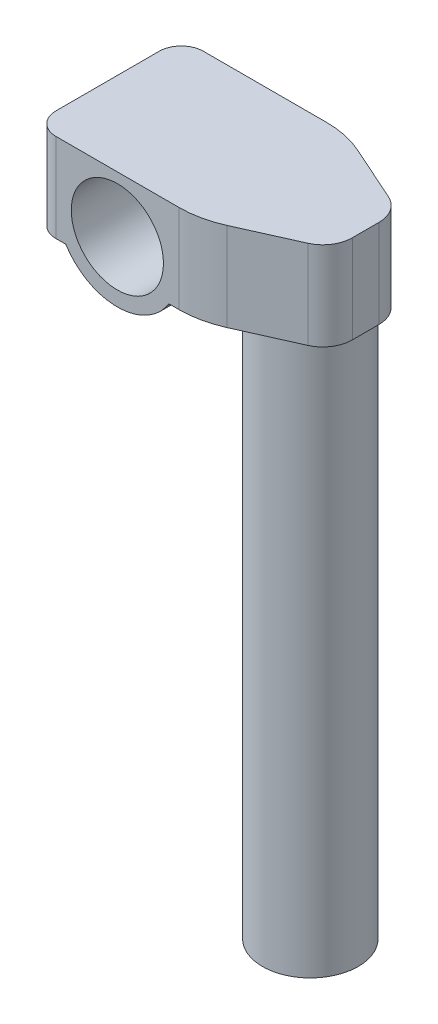
ISO-10303-21;
HEADER;
FILE_DESCRIPTION(('STEP AP214'),'2;1');
FILE_NAME('part.step','',(''),(''),'','','');
FILE_SCHEMA(('AUTOMOTIVE_DESIGN { 1 0 10303 214 1 1 1 1 }'));
ENDSEC;
DATA;
#1=APPLICATION_CONTEXT('core data for automotive mechanical design processes');
#2=APPLICATION_PROTOCOL_DEFINITION('international standard','automotive_design',2000,#1);
#3=PRODUCT_CONTEXT('',#1,'mechanical');
#4=PRODUCT('Part','Part','',(#3));
#5=PRODUCT_RELATED_PRODUCT_CATEGORY('part','',(#4));
#6=PRODUCT_DEFINITION_FORMATION('','',#4);
#7=PRODUCT_DEFINITION_CONTEXT('part definition',#1,'design');
#8=PRODUCT_DEFINITION('design','',#6,#7);
#9=PRODUCT_DEFINITION_SHAPE('','',#8);
#10=(LENGTH_UNIT() NAMED_UNIT(*) SI_UNIT(.MILLI.,.METRE.));
#11=(NAMED_UNIT(*) PLANE_ANGLE_UNIT() SI_UNIT($,.RADIAN.));
#12=(NAMED_UNIT(*) SI_UNIT($,.STERADIAN.) SOLID_ANGLE_UNIT());
#13=UNCERTAINTY_MEASURE_WITH_UNIT(LENGTH_MEASURE(1.E-05),#10,'distance_accuracy_value','');
#14=(GEOMETRIC_REPRESENTATION_CONTEXT(3) GLOBAL_UNCERTAINTY_ASSIGNED_CONTEXT((#13)) GLOBAL_UNIT_ASSIGNED_CONTEXT((#10,
#11,#12)) REPRESENTATION_CONTEXT('',''));
#15=CARTESIAN_POINT('',(0.,0.,0.));
#16=DIRECTION('',(0.,0.,1.));
#17=DIRECTION('',(1.,0.,0.));
#18=AXIS2_PLACEMENT_3D('',#15,#16,#17);
#19=CARTESIAN_POINT('',(-29.,10.,14.));
#20=DIRECTION('',(0.,-1.,0.));
#21=DIRECTION('',(0.,0.,-1.));
#22=AXIS2_PLACEMENT_3D('',#19,#20,#21);
#23=CYLINDRICAL_SURFACE('',#22,6.);
#24=CARTESIAN_POINT('',(-29.,6.,14.));
#25=DIRECTION('',(0.,-1.,0.));
#26=DIRECTION('',(0.,0.,-1.));
#27=AXIS2_PLACEMENT_3D('',#24,#25,#26);
#28=CIRCLE('',#27,6.);
#29=CARTESIAN_POINT('',(-29.,6.,20.));
#30=VERTEX_POINT('',#29);
#31=CARTESIAN_POINT('',(-35.,6.,14.));
#32=VERTEX_POINT('',#31);
#33=EDGE_CURVE('E269',#30,#32,#28,.T.);
#34=ORIENTED_EDGE('',*,*,#33,.F.);
#35=DIRECTION('',(0.,-1.,0.));
#36=VECTOR('',#35,1.);
#37=CARTESIAN_POINT('',(-29.,10.,20.));
#38=LINE('',#37,#36);
#39=CARTESIAN_POINT('',(-29.,30.,20.));
#40=VERTEX_POINT('',#39);
#41=EDGE_CURVE('E12',#40,#30,#38,.T.);
#42=ORIENTED_EDGE('',*,*,#41,.F.);
#43=CARTESIAN_POINT('',(-29.,30.,14.));
#44=DIRECTION('',(0.,1.,0.));
#45=DIRECTION('',(0.,0.,1.));
#46=AXIS2_PLACEMENT_3D('',#43,#44,#45);
#47=CIRCLE('',#46,6.);
#48=CARTESIAN_POINT('',(-35.,30.,14.));
#49=VERTEX_POINT('',#48);
#50=EDGE_CURVE('E165',#49,#40,#47,.T.);
#51=ORIENTED_EDGE('',*,*,#50,.F.);
#52=DIRECTION('',(0.,-1.,0.));
#53=VECTOR('',#52,1.);
#54=CARTESIAN_POINT('',(-35.,10.,14.));
#55=LINE('',#54,#53);
#56=EDGE_CURVE('E67',#49,#32,#55,.T.);
#57=ORIENTED_EDGE('',*,*,#56,.T.);
#58=EDGE_LOOP('',(#34,#42,#51,#57));
#59=FACE_BOUND('',#58,.T.);
#60=ADVANCED_FACE('F52',(#59),#23,.T.);
#61=CARTESIAN_POINT('',(-29.,10.,20.));
#62=DIRECTION('',(0.,0.,-1.));
#63=DIRECTION('',(-1.,0.,0.));
#64=AXIS2_PLACEMENT_3D('',#61,#62,#63);
#65=PLANE('',#64);
#66=CARTESIAN_POINT('',(-12.3376689201528,14.75,20.));
#67=DIRECTION('',(0.,0.,-1.));
#68=DIRECTION('',(1.,0.,0.));
#69=AXIS2_PLACEMENT_3D('',#66,#67,#68);
#70=CIRCLE('',#69,12.5);
#71=CARTESIAN_POINT('',(0.162331079847184,14.75,20.));
#72=VERTEX_POINT('',#71);
#73=EDGE_CURVE('E227',#72,#72,#70,.T.);
#74=ORIENTED_EDGE('',*,*,#73,.T.);
#75=EDGE_LOOP('',(#74));
#76=FACE_BOUND('',#75,.T.);
#77=DIRECTION('',(1.,0.,0.));
#78=VECTOR('',#77,1.);
#79=CARTESIAN_POINT('',(35.,6.,20.));
#80=LINE('',#79,#78);
#81=CARTESIAN_POINT('',(1.65116591338497,6.,20.));
#82=VERTEX_POINT('',#81);
#83=CARTESIAN_POINT('',(4.44212866064467,6.,20.));
#84=VERTEX_POINT('',#83);
#85=EDGE_CURVE('E246',#82,#84,#80,.T.);
#86=ORIENTED_EDGE('',*,*,#85,.T.);
#87=DIRECTION('',(0.,-1.,0.));
#88=VECTOR('',#87,1.);
#89=CARTESIAN_POINT('',(4.44212866064458,10.,20.));
#90=LINE('',#89,#88);
#91=CARTESIAN_POINT('',(4.44212866064458,30.,20.));
#92=VERTEX_POINT('',#91);
#93=EDGE_CURVE('E60',#92,#84,#90,.T.);
#94=ORIENTED_EDGE('',*,*,#93,.F.);
#95=DIRECTION('',(1.,0.,0.));
#96=VECTOR('',#95,1.);
#97=CARTESIAN_POINT('',(-29.,30.,20.));
#98=LINE('',#97,#96);
#99=EDGE_CURVE('E211',#40,#92,#98,.T.);
#100=ORIENTED_EDGE('',*,*,#99,.F.);
#101=ORIENTED_EDGE('',*,*,#41,.T.);
#102=DIRECTION('',(1.,0.,0.));
#103=VECTOR('',#102,1.);
#104=CARTESIAN_POINT('',(-35.,6.,20.));
#105=LINE('',#104,#103);
#106=CARTESIAN_POINT('',(-26.3265037536906,6.,20.));
#107=VERTEX_POINT('',#106);
#108=EDGE_CURVE('E219',#30,#107,#105,.T.);
#109=ORIENTED_EDGE('',*,*,#108,.T.);
#110=CARTESIAN_POINT('',(-12.3376689201528,14.75,20.));
#111=DIRECTION('',(0.,0.,1.));
#112=DIRECTION('',(1.,0.,0.));
#113=AXIS2_PLACEMENT_3D('',#110,#111,#112);
#114=CIRCLE('',#113,16.5);
#115=EDGE_CURVE('E242',#107,#82,#114,.T.);
#116=ORIENTED_EDGE('',*,*,#115,.T.);
#117=EDGE_LOOP('',(#86,#94,#100,#101,#109,#116));
#118=FACE_BOUND('',#117,.T.);
#119=ADVANCED_FACE('F327',(#76,#118),#65,.F.);
#120=CARTESIAN_POINT('',(4.44212866064467,10.,-5.99999999999999));
#121=DIRECTION('',(0.,-1.,0.));
#122=DIRECTION('',(0.,0.,-1.));
#123=AXIS2_PLACEMENT_3D('',#120,#121,#122);
#124=CYLINDRICAL_SURFACE('',#123,26.);
#125=CARTESIAN_POINT('',(4.44212866064467,6.,-5.99999999999999));
#126=DIRECTION('',(0.,-1.,0.));
#127=DIRECTION('',(0.,0.,-1.));
#128=AXIS2_PLACEMENT_3D('',#125,#126,#127);
#129=CIRCLE('',#128,26.);
#130=CARTESIAN_POINT('',(15.0721315666849,6.,17.7276850581252));
#131=VERTEX_POINT('',#130);
#132=EDGE_CURVE('E162',#131,#84,#129,.T.);
#133=ORIENTED_EDGE('',*,*,#132,.F.);
#134=DIRECTION('',(0.,-1.,0.));
#135=VECTOR('',#134,1.);
#136=CARTESIAN_POINT('',(15.0721315666849,10.,17.7276850581252));
#137=LINE('',#136,#135);
#138=CARTESIAN_POINT('',(15.0721315666849,30.,17.7276850581252));
#139=VERTEX_POINT('',#138);
#140=EDGE_CURVE('E75',#139,#131,#137,.T.);
#141=ORIENTED_EDGE('',*,*,#140,.F.);
#142=CARTESIAN_POINT('',(4.44212866064467,30.,-5.99999999999999));
#143=DIRECTION('',(0.,1.,0.));
#144=DIRECTION('',(0.,0.,1.));
#145=AXIS2_PLACEMENT_3D('',#142,#143,#144);
#146=CIRCLE('',#145,26.);
#147=EDGE_CURVE('E207',#92,#139,#146,.T.);
#148=ORIENTED_EDGE('',*,*,#147,.F.);
#149=ORIENTED_EDGE('',*,*,#93,.T.);
#150=EDGE_LOOP('',(#133,#141,#148,#149));
#151=FACE_BOUND('',#150,.T.);
#152=ADVANCED_FACE('F322',(#151),#124,.T.);
#153=CARTESIAN_POINT('',(15.0721315666849,10.,17.7276850581252));
#154=DIRECTION('',(-0.408846265616927,0.,-0.912603271466355));
#155=DIRECTION('',(-0.912603271466355,0.,0.408846265616927));
#156=AXIS2_PLACEMENT_3D('',#153,#154,#155);
#157=PLANE('',#156);
#158=DIRECTION('',(-0.912603271466355,0.,0.408846265616927));
#159=VECTOR('',#158,1.);
#160=CARTESIAN_POINT('',(15.0721315666849,6.,17.7276850581252));
#161=LINE('',#160,#159);
#162=CARTESIAN_POINT('',(30.2707701249354,6.,10.9186949840289));
#163=VERTEX_POINT('',#162);
#164=EDGE_CURVE('E288',#163,#131,#161,.T.);
#165=ORIENTED_EDGE('',*,*,#164,.F.);
#166=DIRECTION('',(0.,-1.,0.));
#167=VECTOR('',#166,1.);
#168=CARTESIAN_POINT('',(30.2707701249354,10.,10.9186949840289));
#169=LINE('',#168,#167);
#170=CARTESIAN_POINT('',(30.2707701249354,30.,10.9186949840289));
#171=VERTEX_POINT('',#170);
#172=EDGE_CURVE('E314',#171,#163,#169,.T.);
#173=ORIENTED_EDGE('',*,*,#172,.F.);
#174=DIRECTION('',(0.912603271466355,0.,-0.408846265616927));
#175=VECTOR('',#174,1.);
#176=CARTESIAN_POINT('',(15.0721315666849,30.,17.7276850581252));
#177=LINE('',#176,#175);
#178=EDGE_CURVE('E203',#139,#171,#177,.T.);
#179=ORIENTED_EDGE('',*,*,#178,.F.);
#180=ORIENTED_EDGE('',*,*,#140,.T.);
#181=EDGE_LOOP('',(#165,#173,#179,#180));
#182=FACE_BOUND('',#181,.T.);
#183=ADVANCED_FACE('F357',(#182),#157,.F.);
#184=CARTESIAN_POINT('',(27.,10.,3.6178688122981));
#185=DIRECTION('',(0.,-1.,0.));
#186=DIRECTION('',(0.,0.,-1.));
#187=AXIS2_PLACEMENT_3D('',#184,#185,#186);
#188=CYLINDRICAL_SURFACE('',#187,8.);
#189=CARTESIAN_POINT('',(27.,6.,3.6178688122981));
#190=DIRECTION('',(0.,-1.,0.));
#191=DIRECTION('',(0.,0.,-1.));
#192=AXIS2_PLACEMENT_3D('',#189,#190,#191);
#193=CIRCLE('',#192,8.);
#194=CARTESIAN_POINT('',(35.,6.,3.61786881229805));
#195=VERTEX_POINT('',#194);
#196=EDGE_CURVE('E284',#195,#163,#193,.T.);
#197=ORIENTED_EDGE('',*,*,#196,.F.);
#198=DIRECTION('',(0.,-1.,0.));
#199=VECTOR('',#198,1.);
#200=CARTESIAN_POINT('',(35.,10.,3.61786881229806));
#201=LINE('',#200,#199);
#202=CARTESIAN_POINT('',(35.,30.,3.61786881229806));
#203=VERTEX_POINT('',#202);
#204=EDGE_CURVE('E311',#203,#195,#201,.T.);
#205=ORIENTED_EDGE('',*,*,#204,.F.);
#206=CARTESIAN_POINT('',(27.,30.,3.6178688122981));
#207=DIRECTION('',(0.,1.,0.));
#208=DIRECTION('',(0.,0.,1.));
#209=AXIS2_PLACEMENT_3D('',#206,#207,#208);
#210=CIRCLE('',#209,8.);
#211=EDGE_CURVE('E199',#171,#203,#210,.T.);
#212=ORIENTED_EDGE('',*,*,#211,.F.);
#213=ORIENTED_EDGE('',*,*,#172,.T.);
#214=EDGE_LOOP('',(#197,#205,#212,#213));
#215=FACE_BOUND('',#214,.T.);
#216=ADVANCED_FACE('F355',(#215),#188,.T.);
#217=CARTESIAN_POINT('',(35.,10.,3.61786881229806));
#218=DIRECTION('',(-1.,0.,0.));
#219=DIRECTION('',(0.,0.,1.));
#220=AXIS2_PLACEMENT_3D('',#217,#218,#219);
#221=PLANE('',#220);
#222=DIRECTION('',(0.,0.,1.));
#223=VECTOR('',#222,1.);
#224=CARTESIAN_POINT('',(35.,6.,-20.));
#225=LINE('',#224,#223);
#226=CARTESIAN_POINT('',(35.,6.,-3.6178688122981));
#227=VERTEX_POINT('',#226);
#228=EDGE_CURVE('E253',#227,#195,#225,.T.);
#229=ORIENTED_EDGE('',*,*,#228,.F.);
#230=DIRECTION('',(0.,-1.,0.));
#231=VECTOR('',#230,1.);
#232=CARTESIAN_POINT('',(35.,10.,-3.61786881229806));
#233=LINE('',#232,#231);
#234=CARTESIAN_POINT('',(35.,30.,-3.61786881229806));
#235=VERTEX_POINT('',#234);
#236=EDGE_CURVE('E308',#235,#227,#233,.T.);
#237=ORIENTED_EDGE('',*,*,#236,.F.);
#238=DIRECTION('',(0.,0.,-1.));
#239=VECTOR('',#238,1.);
#240=CARTESIAN_POINT('',(35.,30.,3.61786881229806));
#241=LINE('',#240,#239);
#242=EDGE_CURVE('E195',#203,#235,#241,.T.);
#243=ORIENTED_EDGE('',*,*,#242,.F.);
#244=ORIENTED_EDGE('',*,*,#204,.T.);
#245=EDGE_LOOP('',(#229,#237,#243,#244));
#246=FACE_BOUND('',#245,.T.);
#247=ADVANCED_FACE('F352',(#246),#221,.F.);
#248=CARTESIAN_POINT('',(27.,10.,-3.6178688122981));
#249=DIRECTION('',(0.,-1.,0.));
#250=DIRECTION('',(0.,0.,-1.));
#251=AXIS2_PLACEMENT_3D('',#248,#249,#250);
#252=CYLINDRICAL_SURFACE('',#251,8.);
#253=CARTESIAN_POINT('',(27.,6.,-3.6178688122981));
#254=DIRECTION('',(0.,-1.,0.));
#255=DIRECTION('',(0.,0.,-1.));
#256=AXIS2_PLACEMENT_3D('',#253,#254,#255);
#257=CIRCLE('',#256,8.);
#258=CARTESIAN_POINT('',(30.2707701249354,6.,-10.918694984029));
#259=VERTEX_POINT('',#258);
#260=EDGE_CURVE('E280',#259,#227,#257,.T.);
#261=ORIENTED_EDGE('',*,*,#260,.F.);
#262=DIRECTION('',(0.,-1.,0.));
#263=VECTOR('',#262,1.);
#264=CARTESIAN_POINT('',(30.2707701249354,10.,-10.918694984029));
#265=LINE('',#264,#263);
#266=CARTESIAN_POINT('',(30.2707701249354,30.,-10.918694984029));
#267=VERTEX_POINT('',#266);
#268=EDGE_CURVE('E305',#267,#259,#265,.T.);
#269=ORIENTED_EDGE('',*,*,#268,.F.);
#270=CARTESIAN_POINT('',(27.,30.,-3.6178688122981));
#271=DIRECTION('',(0.,1.,0.));
#272=DIRECTION('',(0.,0.,1.));
#273=AXIS2_PLACEMENT_3D('',#270,#271,#272);
#274=CIRCLE('',#273,8.);
#275=EDGE_CURVE('E191',#235,#267,#274,.T.);
#276=ORIENTED_EDGE('',*,*,#275,.F.);
#277=ORIENTED_EDGE('',*,*,#236,.T.);
#278=EDGE_LOOP('',(#261,#269,#276,#277));
#279=FACE_BOUND('',#278,.T.);
#280=ADVANCED_FACE('F348',(#279),#252,.T.);
#281=CARTESIAN_POINT('',(30.2707701249354,10.,-10.918694984029));
#282=DIRECTION('',(-0.408846265616927,0.,0.912603271466355));
#283=DIRECTION('',(0.912603271466355,0.,0.408846265616927));
#284=AXIS2_PLACEMENT_3D('',#281,#282,#283);
#285=PLANE('',#284);
#286=DIRECTION('',(0.912603271466355,0.,0.408846265616927));
#287=VECTOR('',#286,1.);
#288=CARTESIAN_POINT('',(30.2707701249354,6.,-10.918694984029));
#289=LINE('',#288,#287);
#290=CARTESIAN_POINT('',(15.0721315666849,6.,-17.7276850581252));
#291=VERTEX_POINT('',#290);
#292=EDGE_CURVE('E276',#291,#259,#289,.T.);
#293=ORIENTED_EDGE('',*,*,#292,.F.);
#294=DIRECTION('',(0.,-1.,0.));
#295=VECTOR('',#294,1.);
#296=CARTESIAN_POINT('',(15.0721315666849,10.,-17.7276850581252));
#297=LINE('',#296,#295);
#298=CARTESIAN_POINT('',(15.0721315666849,30.,-17.7276850581252));
#299=VERTEX_POINT('',#298);
#300=EDGE_CURVE('E302',#299,#291,#297,.T.);
#301=ORIENTED_EDGE('',*,*,#300,.F.);
#302=DIRECTION('',(-0.912603271466355,0.,-0.408846265616927));
#303=VECTOR('',#302,1.);
#304=CARTESIAN_POINT('',(30.2707701249354,30.,-10.918694984029));
#305=LINE('',#304,#303);
#306=EDGE_CURVE('E187',#267,#299,#305,.T.);
#307=ORIENTED_EDGE('',*,*,#306,.F.);
#308=ORIENTED_EDGE('',*,*,#268,.T.);
#309=EDGE_LOOP('',(#293,#301,#307,#308));
#310=FACE_BOUND('',#309,.T.);
#311=ADVANCED_FACE('F344',(#310),#285,.F.);
#312=CARTESIAN_POINT('',(4.44212866064467,10.,5.99999999999999));
#313=DIRECTION('',(0.,-1.,0.));
#314=DIRECTION('',(0.,0.,-1.));
#315=AXIS2_PLACEMENT_3D('',#312,#313,#314);
#316=CYLINDRICAL_SURFACE('',#315,26.);
#317=CARTESIAN_POINT('',(4.44212866064467,6.,5.99999999999999));
#318=DIRECTION('',(0.,-1.,0.));
#319=DIRECTION('',(0.,0.,-1.));
#320=AXIS2_PLACEMENT_3D('',#317,#318,#319);
#321=CIRCLE('',#320,26.);
#322=CARTESIAN_POINT('',(4.44212866064457,6.,-20.));
#323=VERTEX_POINT('',#322);
#324=EDGE_CURVE('E272',#323,#291,#321,.T.);
#325=ORIENTED_EDGE('',*,*,#324,.F.);
#326=DIRECTION('',(0.,-1.,0.));
#327=VECTOR('',#326,1.);
#328=CARTESIAN_POINT('',(4.44212866064457,10.,-20.));
#329=LINE('',#328,#327);
#330=CARTESIAN_POINT('',(4.44212866064457,30.,-20.));
#331=VERTEX_POINT('',#330);
#332=EDGE_CURVE('E299',#331,#323,#329,.T.);
#333=ORIENTED_EDGE('',*,*,#332,.F.);
#334=CARTESIAN_POINT('',(4.44212866064467,30.,5.99999999999999));
#335=DIRECTION('',(0.,1.,0.));
#336=DIRECTION('',(0.,0.,-1.));
#337=AXIS2_PLACEMENT_3D('',#334,#335,#336);
#338=CIRCLE('',#337,26.);
#339=EDGE_CURVE('E183',#299,#331,#338,.T.);
#340=ORIENTED_EDGE('',*,*,#339,.F.);
#341=ORIENTED_EDGE('',*,*,#300,.T.);
#342=EDGE_LOOP('',(#325,#333,#340,#341));
#343=FACE_BOUND('',#342,.T.);
#344=ADVANCED_FACE('F339',(#343),#316,.T.);
#345=CARTESIAN_POINT('',(4.44212866064457,10.,-20.));
#346=DIRECTION('',(0.,0.,1.));
#347=DIRECTION('',(1.,0.,0.));
#348=AXIS2_PLACEMENT_3D('',#345,#346,#347);
#349=PLANE('',#348);
#350=CARTESIAN_POINT('',(-12.3376689201528,14.75,-20.));
#351=DIRECTION('',(0.,0.,-1.));
#352=DIRECTION('',(1.,0.,0.));
#353=AXIS2_PLACEMENT_3D('',#350,#351,#352);
#354=CIRCLE('',#353,12.5);
#355=CARTESIAN_POINT('',(0.162331079847184,14.75,-20.));
#356=VERTEX_POINT('',#355);
#357=EDGE_CURVE('E235',#356,#356,#354,.T.);
#358=ORIENTED_EDGE('',*,*,#357,.F.);
#359=EDGE_LOOP('',(#358));
#360=FACE_BOUND('',#359,.T.);
#361=DIRECTION('',(1.,0.,0.));
#362=VECTOR('',#361,1.);
#363=CARTESIAN_POINT('',(-35.,6.,-20.));
#364=LINE('',#363,#362);
#365=CARTESIAN_POINT('',(-29.,6.,-20.));
#366=VERTEX_POINT('',#365);
#367=CARTESIAN_POINT('',(-26.3265037536906,6.,-20.));
#368=VERTEX_POINT('',#367);
#369=EDGE_CURVE('E223',#366,#368,#364,.T.);
#370=ORIENTED_EDGE('',*,*,#369,.F.);
#371=DIRECTION('',(0.,-1.,0.));
#372=VECTOR('',#371,1.);
#373=CARTESIAN_POINT('',(-29.,10.,-20.));
#374=LINE('',#373,#372);
#375=CARTESIAN_POINT('',(-29.,30.,-20.));
#376=VERTEX_POINT('',#375);
#377=EDGE_CURVE('E296',#376,#366,#374,.T.);
#378=ORIENTED_EDGE('',*,*,#377,.F.);
#379=DIRECTION('',(-1.,0.,0.));
#380=VECTOR('',#379,1.);
#381=CARTESIAN_POINT('',(4.44212866064457,30.,-20.));
#382=LINE('',#381,#380);
#383=EDGE_CURVE('E178',#331,#376,#382,.T.);
#384=ORIENTED_EDGE('',*,*,#383,.F.);
#385=ORIENTED_EDGE('',*,*,#332,.T.);
#386=DIRECTION('',(1.,0.,0.));
#387=VECTOR('',#386,1.);
#388=CARTESIAN_POINT('',(35.,6.,-20.));
#389=LINE('',#388,#387);
#390=CARTESIAN_POINT('',(1.65116591338497,6.,-20.));
#391=VERTEX_POINT('',#390);
#392=EDGE_CURVE('E231',#391,#323,#389,.T.);
#393=ORIENTED_EDGE('',*,*,#392,.F.);
#394=CARTESIAN_POINT('',(-12.3376689201528,14.75,-20.));
#395=DIRECTION('',(0.,0.,1.));
#396=DIRECTION('',(1.,0.,0.));
#397=AXIS2_PLACEMENT_3D('',#394,#395,#396);
#398=CIRCLE('',#397,16.5);
#399=EDGE_CURVE('E226',#368,#391,#398,.T.);
#400=ORIENTED_EDGE('',*,*,#399,.F.);
#401=EDGE_LOOP('',(#370,#378,#384,#385,#393,#400));
#402=FACE_BOUND('',#401,.T.);
#403=ADVANCED_FACE('F362',(#360,#402),#349,.F.);
#404=CARTESIAN_POINT('',(-29.,10.,-14.));
#405=DIRECTION('',(0.,-1.,0.));
#406=DIRECTION('',(0.,0.,-1.));
#407=AXIS2_PLACEMENT_3D('',#404,#405,#406);
#408=CYLINDRICAL_SURFACE('',#407,6.);
#409=CARTESIAN_POINT('',(-29.,6.,-14.));
#410=DIRECTION('',(0.,-1.,0.));
#411=DIRECTION('',(0.,0.,-1.));
#412=AXIS2_PLACEMENT_3D('',#409,#410,#411);
#413=CIRCLE('',#412,6.);
#414=CARTESIAN_POINT('',(-35.,6.,-14.));
#415=VERTEX_POINT('',#414);
#416=EDGE_CURVE('E257',#415,#366,#413,.T.);
#417=ORIENTED_EDGE('',*,*,#416,.F.);
#418=DIRECTION('',(0.,-1.,0.));
#419=VECTOR('',#418,1.);
#420=CARTESIAN_POINT('',(-35.,10.,-14.));
#421=LINE('',#420,#419);
#422=CARTESIAN_POINT('',(-35.,30.,-14.));
#423=VERTEX_POINT('',#422);
#424=EDGE_CURVE('E161',#423,#415,#421,.T.);
#425=ORIENTED_EDGE('',*,*,#424,.F.);
#426=CARTESIAN_POINT('',(-29.,30.,-14.));
#427=DIRECTION('',(0.,1.,0.));
#428=DIRECTION('',(0.,0.,1.));
#429=AXIS2_PLACEMENT_3D('',#426,#427,#428);
#430=CIRCLE('',#429,6.);
#431=EDGE_CURVE('E174',#376,#423,#430,.T.);
#432=ORIENTED_EDGE('',*,*,#431,.F.);
#433=ORIENTED_EDGE('',*,*,#377,.T.);
#434=EDGE_LOOP('',(#417,#425,#432,#433));
#435=FACE_BOUND('',#434,.T.);
#436=ADVANCED_FACE('F364',(#435),#408,.T.);
#437=CARTESIAN_POINT('',(-35.,10.,-14.));
#438=DIRECTION('',(1.,0.,0.));
#439=DIRECTION('',(0.,0.,-1.));
#440=AXIS2_PLACEMENT_3D('',#437,#438,#439);
#441=PLANE('',#440);
#442=DIRECTION('',(0.,0.,1.));
#443=VECTOR('',#442,1.);
#444=CARTESIAN_POINT('',(-35.,6.,-20.));
#445=LINE('',#444,#443);
#446=EDGE_CURVE('E159',#415,#32,#445,.T.);
#447=ORIENTED_EDGE('',*,*,#446,.T.);
#448=ORIENTED_EDGE('',*,*,#56,.F.);
#449=DIRECTION('',(0.,0.,1.));
#450=VECTOR('',#449,1.);
#451=CARTESIAN_POINT('',(-35.,30.,-14.));
#452=LINE('',#451,#450);
#453=EDGE_CURVE('E156',#423,#49,#452,.T.);
#454=ORIENTED_EDGE('',*,*,#453,.F.);
#455=ORIENTED_EDGE('',*,*,#424,.T.);
#456=EDGE_LOOP('',(#447,#448,#454,#455));
#457=FACE_BOUND('',#456,.T.);
#458=ADVANCED_FACE('F154',(#457),#441,.F.);
#459=CARTESIAN_POINT('',(-12.3376689201528,14.75,-20.));
#460=DIRECTION('',(0.,0.,1.));
#461=DIRECTION('',(1.,0.,0.));
#462=AXIS2_PLACEMENT_3D('',#459,#460,#461);
#463=CYLINDRICAL_SURFACE('',#462,12.5);
#464=CARTESIAN_POINT('',(0.162331079847184,14.75,20.));
#465=CARTESIAN_POINT('',(0.162331079847184,14.75,19.5833333333333));
#466=CARTESIAN_POINT('',(0.162331079847184,14.75,19.1666666666667));
#467=CARTESIAN_POINT('',(0.162331079847184,14.75,18.3333333333333));
#468=CARTESIAN_POINT('',(0.162331079847184,14.75,17.9166666666667));
#469=CARTESIAN_POINT('',(0.162331079847184,14.75,17.0833333333333));
#470=CARTESIAN_POINT('',(0.162331079847184,14.75,16.6666666666667));
#471=CARTESIAN_POINT('',(0.162331079847184,14.75,15.8333333333333));
#472=CARTESIAN_POINT('',(0.162331079847184,14.75,15.4166666666667));
#473=CARTESIAN_POINT('',(0.162331079847184,14.75,14.5833333333333));
#474=CARTESIAN_POINT('',(0.162331079847184,14.75,14.1666666666667));
#475=CARTESIAN_POINT('',(0.162331079847184,14.75,13.3333333333333));
#476=CARTESIAN_POINT('',(0.162331079847184,14.75,12.9166666666667));
#477=CARTESIAN_POINT('',(0.162331079847184,14.75,12.0833333333333));
#478=CARTESIAN_POINT('',(0.162331079847184,14.75,11.6666666666667));
#479=CARTESIAN_POINT('',(0.162331079847184,14.75,10.8333333333333));
#480=CARTESIAN_POINT('',(0.162331079847184,14.75,10.4166666666667));
#481=CARTESIAN_POINT('',(0.162331079847184,14.75,9.58333333333334));
#482=CARTESIAN_POINT('',(0.162331079847184,14.75,9.16666666666667));
#483=CARTESIAN_POINT('',(0.162331079847184,14.75,8.33333333333334));
#484=CARTESIAN_POINT('',(0.162331079847184,14.75,7.91666666666667));
#485=CARTESIAN_POINT('',(0.162331079847184,14.75,7.08333333333334));
#486=CARTESIAN_POINT('',(0.162331079847184,14.75,6.66666666666667));
#487=CARTESIAN_POINT('',(0.162331079847184,14.75,5.83333333333334));
#488=CARTESIAN_POINT('',(0.162331079847184,14.75,5.41666666666667));
#489=CARTESIAN_POINT('',(0.162331079847184,14.75,4.58333333333334));
#490=CARTESIAN_POINT('',(0.162331079847184,14.75,4.16666666666667));
#491=CARTESIAN_POINT('',(0.162331079847184,14.75,3.33333333333334));
#492=CARTESIAN_POINT('',(0.162331079847184,14.75,2.91666666666667));
#493=CARTESIAN_POINT('',(0.162331079847184,14.75,2.08333333333334));
#494=CARTESIAN_POINT('',(0.162331079847184,14.75,1.66666666666667));
#495=CARTESIAN_POINT('',(0.162331079847184,14.75,0.833333333333334));
#496=CARTESIAN_POINT('',(0.162331079847184,14.75,0.416666666666667));
#497=CARTESIAN_POINT('',(0.162331079847184,14.75,-0.416666666666667));
#498=CARTESIAN_POINT('',(0.162331079847184,14.75,-0.833333333333334));
#499=CARTESIAN_POINT('',(0.162331079847184,14.75,-1.66666666666667));
#500=CARTESIAN_POINT('',(0.162331079847184,14.75,-2.08333333333334));
#501=CARTESIAN_POINT('',(0.162331079847184,14.75,-2.91666666666667));
#502=CARTESIAN_POINT('',(0.162331079847184,14.75,-3.33333333333334));
#503=CARTESIAN_POINT('',(0.162331079847184,14.75,-4.16666666666667));
#504=CARTESIAN_POINT('',(0.162331079847184,14.75,-4.58333333333334));
#505=CARTESIAN_POINT('',(0.162331079847184,14.75,-5.41666666666667));
#506=CARTESIAN_POINT('',(0.162331079847184,14.75,-5.83333333333333));
#507=CARTESIAN_POINT('',(0.162331079847184,14.75,-6.66666666666667));
#508=CARTESIAN_POINT('',(0.162331079847184,14.75,-7.08333333333333));
#509=CARTESIAN_POINT('',(0.162331079847184,14.75,-7.91666666666667));
#510=CARTESIAN_POINT('',(0.162331079847184,14.75,-8.33333333333334));
#511=CARTESIAN_POINT('',(0.162331079847184,14.75,-9.16666666666667));
#512=CARTESIAN_POINT('',(0.162331079847184,14.75,-9.58333333333334));
#513=CARTESIAN_POINT('',(0.162331079847184,14.75,-10.4166666666667));
#514=CARTESIAN_POINT('',(0.162331079847184,14.75,-10.8333333333333));
#515=CARTESIAN_POINT('',(0.162331079847184,14.75,-11.6666666666667));
#516=CARTESIAN_POINT('',(0.162331079847184,14.75,-12.0833333333333));
#517=CARTESIAN_POINT('',(0.162331079847184,14.75,-12.9166666666667));
#518=CARTESIAN_POINT('',(0.162331079847184,14.75,-13.3333333333333));
#519=CARTESIAN_POINT('',(0.162331079847184,14.75,-14.1666666666667));
#520=CARTESIAN_POINT('',(0.162331079847184,14.75,-14.5833333333333));
#521=CARTESIAN_POINT('',(0.162331079847184,14.75,-15.4166666666667));
#522=CARTESIAN_POINT('',(0.162331079847184,14.75,-15.8333333333333));
#523=CARTESIAN_POINT('',(0.162331079847184,14.75,-16.6666666666667));
#524=CARTESIAN_POINT('',(0.162331079847184,14.75,-17.0833333333333));
#525=CARTESIAN_POINT('',(0.162331079847184,14.75,-17.9166666666667));
#526=CARTESIAN_POINT('',(0.162331079847184,14.75,-18.3333333333333));
#527=CARTESIAN_POINT('',(0.162331079847184,14.75,-19.1666666666667));
#528=CARTESIAN_POINT('',(0.162331079847184,14.75,-19.5833333333333));
#529=CARTESIAN_POINT('',(0.162331079847184,14.75,-20.));
#530=B_SPLINE_CURVE_WITH_KNOTS('',3,(#464,#465,#466,#467,#468,#469,#470,#471,#472,#473,#474,
#475,#476,#477,#478,#479,#480,#481,#482,#483,#484,#485,#486,#487,#488,#489,#490,#491,#492,#493,
#494,#495,#496,#497,#498,#499,#500,#501,#502,#503,#504,#505,#506,#507,#508,#509,#510,#511,#512,
#513,#514,#515,#516,#517,#518,#519,#520,#521,#522,#523,#524,#525,#526,#527,#528,#529),
.UNSPECIFIED.,.F.,.F.,(4,2,2,2,2,2,2,2,2,2,2,2,2,2,2,2,2,2,2,2,2,2,2,2,2,2,2,2,2,2,2,2,4),(0.,
1.25,2.5,3.75,5.,6.25000000000001,7.50000000000001,8.75000000000001,10.,11.25,12.5,13.75,15.,
16.25,17.5,18.75,20.,21.25,22.5,23.75,25.,26.25,27.5,28.75,30.,31.25,32.5,33.75,35.,36.25,37.5,
38.75,40.),.UNSPECIFIED.);
#531=EDGE_CURVE('BSEAM371',#72,#356,#530,.T.);
#532=ORIENTED_EDGE('',*,*,#73,.F.);
#533=ORIENTED_EDGE('',*,*,#357,.T.);
#534=ORIENTED_EDGE('',*,*,#531,.T.);
#535=ORIENTED_EDGE('',*,*,#531,.F.);
#536=EDGE_LOOP('',(#532,#534,#533,#535));
#537=FACE_BOUND('',#536,.T.);
#538=ADVANCED_FACE('F371',(#537),#463,.F.);
#539=CARTESIAN_POINT('',(35.,6.,-20.));
#540=DIRECTION('',(0.,-1.,0.));
#541=DIRECTION('',(0.,0.,-1.));
#542=AXIS2_PLACEMENT_3D('',#539,#540,#541);
#543=PLANE('',#542);
#544=CARTESIAN_POINT('',(20.,6.,0.));
#545=DIRECTION('',(0.,-1.,0.));
#546=DIRECTION('',(0.,0.,-1.));
#547=AXIS2_PLACEMENT_3D('',#544,#545,#546);
#548=CIRCLE('',#547,13.);
#549=CARTESIAN_POINT('',(20.,6.,-13.));
#550=VERTEX_POINT('',#549);
#551=EDGE_CURVE('E214',#550,#550,#548,.T.);
#552=ORIENTED_EDGE('',*,*,#551,.F.);
#553=EDGE_LOOP('',(#552));
#554=FACE_BOUND('',#553,.T.);
#555=ORIENTED_EDGE('',*,*,#132,.T.);
#556=ORIENTED_EDGE('',*,*,#85,.F.);
#557=DIRECTION('',(0.,0.,1.));
#558=VECTOR('',#557,1.);
#559=CARTESIAN_POINT('',(1.65116591338497,6.,-20.));
#560=LINE('',#559,#558);
#561=EDGE_CURVE('E258',#391,#82,#560,.T.);
#562=ORIENTED_EDGE('',*,*,#561,.F.);
#563=ORIENTED_EDGE('',*,*,#392,.T.);
#564=ORIENTED_EDGE('',*,*,#324,.T.);
#565=ORIENTED_EDGE('',*,*,#292,.T.);
#566=ORIENTED_EDGE('',*,*,#260,.T.);
#567=ORIENTED_EDGE('',*,*,#228,.T.);
#568=ORIENTED_EDGE('',*,*,#196,.T.);
#569=ORIENTED_EDGE('',*,*,#164,.T.);
#570=EDGE_LOOP('',(#555,#556,#562,#563,#564,#565,#566,#567,#568,#569));
#571=FACE_BOUND('',#570,.T.);
#572=ADVANCED_FACE('F326',(#554,#571),#543,.T.);
#573=CARTESIAN_POINT('',(-35.,6.,-20.));
#574=DIRECTION('',(0.,-1.,0.));
#575=DIRECTION('',(0.,0.,-1.));
#576=AXIS2_PLACEMENT_3D('',#573,#574,#575);
#577=PLANE('',#576);
#578=ORIENTED_EDGE('',*,*,#33,.T.);
#579=ORIENTED_EDGE('',*,*,#446,.F.);
#580=ORIENTED_EDGE('',*,*,#416,.T.);
#581=ORIENTED_EDGE('',*,*,#369,.T.);
#582=DIRECTION('',(0.,0.,1.));
#583=VECTOR('',#582,1.);
#584=CARTESIAN_POINT('',(-26.3265037536906,6.,-20.));
#585=LINE('',#584,#583);
#586=EDGE_CURVE('E261',#368,#107,#585,.T.);
#587=ORIENTED_EDGE('',*,*,#586,.T.);
#588=ORIENTED_EDGE('',*,*,#108,.F.);
#589=EDGE_LOOP('',(#578,#579,#580,#581,#587,#588));
#590=FACE_BOUND('',#589,.T.);
#591=ADVANCED_FACE('F359',(#590),#577,.T.);
#592=CARTESIAN_POINT('',(-12.3376689201528,14.75,-20.));
#593=DIRECTION('',(0.,0.,1.));
#594=DIRECTION('',(1.,0.,0.));
#595=AXIS2_PLACEMENT_3D('',#592,#593,#594);
#596=CYLINDRICAL_SURFACE('',#595,16.5);
#597=ORIENTED_EDGE('',*,*,#115,.F.);
#598=ORIENTED_EDGE('',*,*,#586,.F.);
#599=ORIENTED_EDGE('',*,*,#399,.T.);
#600=ORIENTED_EDGE('',*,*,#561,.T.);
#601=EDGE_LOOP('',(#597,#598,#599,#600));
#602=FACE_BOUND('',#601,.T.);
#603=ADVANCED_FACE('F332',(#602),#596,.T.);
#604=CARTESIAN_POINT('',(20.,-144.,0.));
#605=DIRECTION('',(0.,1.,0.));
#606=DIRECTION('',(0.,0.,1.));
#607=AXIS2_PLACEMENT_3D('',#604,#605,#606);
#608=CYLINDRICAL_SURFACE('',#607,13.);
#609=CARTESIAN_POINT('',(20.,-144.,0.));
#610=DIRECTION('',(0.,-1.,0.));
#611=DIRECTION('',(0.,0.,-1.));
#612=AXIS2_PLACEMENT_3D('',#609,#610,#611);
#613=CIRCLE('',#612,13.);
#614=CARTESIAN_POINT('',(20.,-144.,-13.));
#615=VERTEX_POINT('',#614);
#616=EDGE_CURVE('E215',#615,#615,#613,.T.);
#617=ORIENTED_EDGE('',*,*,#616,.F.);
#618=EDGE_LOOP('',(#617));
#619=FACE_BOUND('',#618,.T.);
#620=ORIENTED_EDGE('',*,*,#551,.T.);
#621=EDGE_LOOP('',(#620));
#622=FACE_BOUND('',#621,.T.);
#623=ADVANCED_FACE('F445',(#619,#622),#608,.T.);
#624=CARTESIAN_POINT('',(20.,-144.,0.));
#625=DIRECTION('',(0.,-1.,0.));
#626=DIRECTION('',(0.,0.,-1.));
#627=AXIS2_PLACEMENT_3D('',#624,#625,#626);
#628=PLANE('',#627);
#629=ORIENTED_EDGE('',*,*,#616,.T.);
#630=EDGE_LOOP('',(#629));
#631=FACE_BOUND('',#630,.T.);
#632=ADVANCED_FACE('F453',(#631),#628,.T.);
#633=CARTESIAN_POINT('',(-29.,30.,14.));
#634=DIRECTION('',(0.,-1.,0.));
#635=DIRECTION('',(0.,0.,1.));
#636=AXIS2_PLACEMENT_3D('',#633,#634,#635);
#637=PLANE('',#636);
#638=ORIENTED_EDGE('',*,*,#50,.T.);
#639=ORIENTED_EDGE('',*,*,#99,.T.);
#640=ORIENTED_EDGE('',*,*,#147,.T.);
#641=ORIENTED_EDGE('',*,*,#178,.T.);
#642=ORIENTED_EDGE('',*,*,#211,.T.);
#643=ORIENTED_EDGE('',*,*,#242,.T.);
#644=ORIENTED_EDGE('',*,*,#275,.T.);
#645=ORIENTED_EDGE('',*,*,#306,.T.);
#646=ORIENTED_EDGE('',*,*,#339,.T.);
#647=ORIENTED_EDGE('',*,*,#383,.T.);
#648=ORIENTED_EDGE('',*,*,#431,.T.);
#649=ORIENTED_EDGE('',*,*,#453,.T.);
#650=EDGE_LOOP('',(#638,#639,#640,#641,#642,#643,#644,#645,#646,#647,#648,#649));
#651=FACE_BOUND('',#650,.T.);
#652=ADVANCED_FACE('F171',(#651),#637,.F.);
#653=CLOSED_SHELL('',(#60,#119,#152,#183,#216,#247,#280,#311,#344,#403,#436,#458,#538,#572,#591,
#603,#623,#632,#652));
#654=MANIFOLD_SOLID_BREP('B2',#653);
#655=ADVANCED_BREP_SHAPE_REPRESENTATION('',(#18,#654),#14);
#656=SHAPE_DEFINITION_REPRESENTATION(#9,#655);
ENDSEC;
END-ISO-10303-21;
